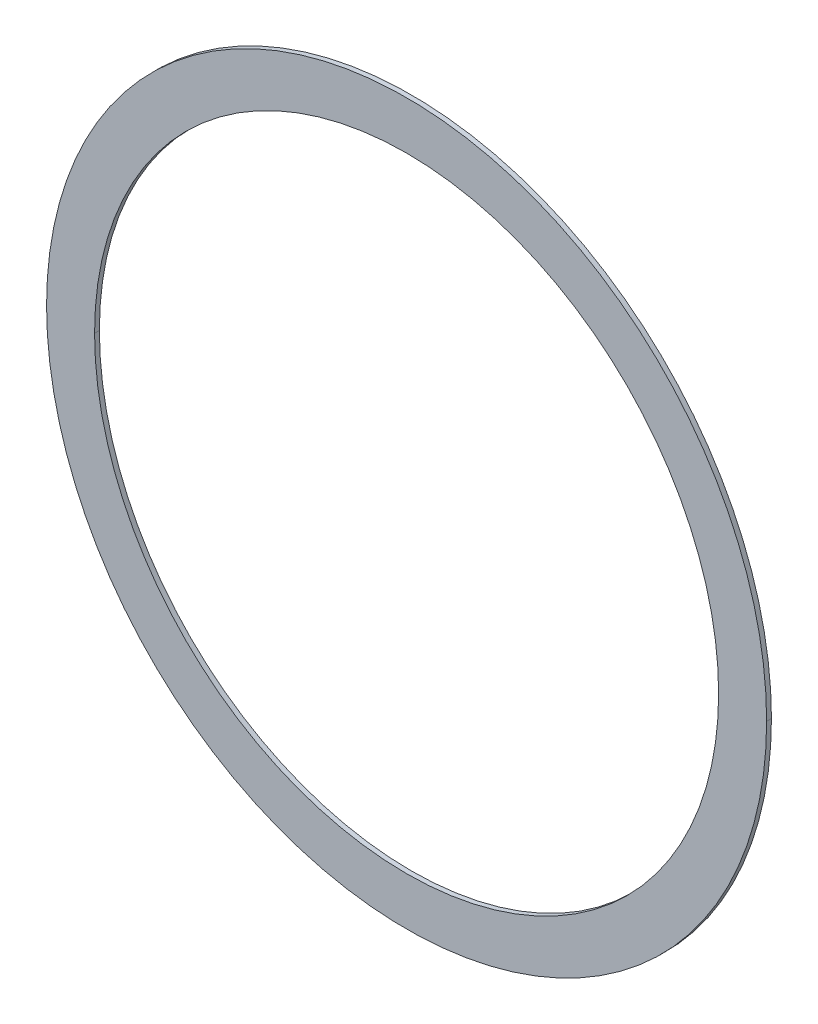
ISO-10303-21;
HEADER;
FILE_DESCRIPTION(('STEP AP214'),'2;1');
FILE_NAME('part.step','',(''),(''),'','','');
FILE_SCHEMA(('AUTOMOTIVE_DESIGN { 1 0 10303 214 1 1 1 1 }'));
ENDSEC;
DATA;
#1=APPLICATION_CONTEXT('core data for automotive mechanical design processes');
#2=APPLICATION_PROTOCOL_DEFINITION('international standard','automotive_design',2000,#1);
#3=PRODUCT_CONTEXT('',#1,'mechanical');
#4=PRODUCT('Part','Part','',(#3));
#5=PRODUCT_RELATED_PRODUCT_CATEGORY('part','',(#4));
#6=PRODUCT_DEFINITION_FORMATION('','',#4);
#7=PRODUCT_DEFINITION_CONTEXT('part definition',#1,'design');
#8=PRODUCT_DEFINITION('design','',#6,#7);
#9=PRODUCT_DEFINITION_SHAPE('','',#8);
#10=(LENGTH_UNIT() NAMED_UNIT(*) SI_UNIT(.MILLI.,.METRE.));
#11=(NAMED_UNIT(*) PLANE_ANGLE_UNIT() SI_UNIT($,.RADIAN.));
#12=(NAMED_UNIT(*) SI_UNIT($,.STERADIAN.) SOLID_ANGLE_UNIT());
#13=UNCERTAINTY_MEASURE_WITH_UNIT(LENGTH_MEASURE(1.E-05),#10,'distance_accuracy_value','');
#14=(GEOMETRIC_REPRESENTATION_CONTEXT(3) GLOBAL_UNCERTAINTY_ASSIGNED_CONTEXT((#13)) GLOBAL_UNIT_ASSIGNED_CONTEXT((#10,
#11,#12)) REPRESENTATION_CONTEXT('',''));
#15=CARTESIAN_POINT('',(0.,0.,0.));
#16=DIRECTION('',(0.,0.,1.));
#17=DIRECTION('',(1.,0.,0.));
#18=AXIS2_PLACEMENT_3D('',#15,#16,#17);
#19=CARTESIAN_POINT('',(0.,0.,-0.0015));
#20=DIRECTION('',(0.,0.,1.));
#21=DIRECTION('',(1.,0.,0.));
#22=AXIS2_PLACEMENT_3D('',#19,#20,#21);
#23=CYLINDRICAL_SURFACE('',#22,0.225);
#24=CARTESIAN_POINT('',(0.,0.,-0.0015));
#25=DIRECTION('',(0.,0.,1.));
#26=DIRECTION('',(1.,0.,0.));
#27=AXIS2_PLACEMENT_3D('',#24,#25,#26);
#28=CIRCLE('',#27,0.225);
#29=CARTESIAN_POINT('',(0.225,0.,-0.0015));
#30=VERTEX_POINT('',#29);
#31=CARTESIAN_POINT('',(-0.225,0.,-0.0015));
#32=VERTEX_POINT('',#31);
#33=EDGE_CURVE('E11',#30,#32,#28,.T.);
#34=ORIENTED_EDGE('',*,*,#33,.T.);
#35=DIRECTION('',(0.,0.,1.));
#36=VECTOR('',#35,1.);
#37=CARTESIAN_POINT('',(-0.225,0.,-0.0015));
#38=LINE('',#37,#36);
#39=CARTESIAN_POINT('',(-0.225,0.,0.0015));
#40=VERTEX_POINT('',#39);
#41=EDGE_CURVE('E24',#32,#40,#38,.T.);
#42=ORIENTED_EDGE('',*,*,#41,.T.);
#43=CARTESIAN_POINT('',(0.,0.,0.0015));
#44=DIRECTION('',(0.,0.,1.));
#45=DIRECTION('',(1.,0.,0.));
#46=AXIS2_PLACEMENT_3D('',#43,#44,#45);
#47=CIRCLE('',#46,0.225);
#48=CARTESIAN_POINT('',(0.225,0.,0.0015));
#49=VERTEX_POINT('',#48);
#50=EDGE_CURVE('E86',#49,#40,#47,.T.);
#51=ORIENTED_EDGE('',*,*,#50,.F.);
#52=DIRECTION('',(0.,0.,1.));
#53=VECTOR('',#52,1.);
#54=CARTESIAN_POINT('',(0.225,0.,-0.0015));
#55=LINE('',#54,#53);
#56=EDGE_CURVE('E83',#30,#49,#55,.T.);
#57=ORIENTED_EDGE('',*,*,#56,.F.);
#58=EDGE_LOOP('',(#34,#42,#51,#57));
#59=FACE_BOUND('',#58,.T.);
#60=ADVANCED_FACE('F17',(#59),#23,.T.);
#61=CARTESIAN_POINT('',(0.,0.,-0.0015));
#62=DIRECTION('',(0.,0.,1.));
#63=DIRECTION('',(1.,0.,0.));
#64=AXIS2_PLACEMENT_3D('',#61,#62,#63);
#65=CYLINDRICAL_SURFACE('',#64,0.195);
#66=CARTESIAN_POINT('',(0.,0.,-0.0015));
#67=DIRECTION('',(0.,0.,1.));
#68=DIRECTION('',(1.,0.,0.));
#69=AXIS2_PLACEMENT_3D('',#66,#67,#68);
#70=CIRCLE('',#69,0.195);
#71=CARTESIAN_POINT('',(-0.195,0.,-0.0015));
#72=VERTEX_POINT('',#71);
#73=CARTESIAN_POINT('',(0.195,0.,-0.0015));
#74=VERTEX_POINT('',#73);
#75=EDGE_CURVE('E81',#72,#74,#70,.T.);
#76=ORIENTED_EDGE('',*,*,#75,.F.);
#77=DIRECTION('',(0.,0.,1.));
#78=VECTOR('',#77,1.);
#79=CARTESIAN_POINT('',(-0.195,0.,-0.0015));
#80=LINE('',#79,#78);
#81=CARTESIAN_POINT('',(-0.195,0.,0.0015));
#82=VERTEX_POINT('',#81);
#83=EDGE_CURVE('E67',#72,#82,#80,.T.);
#84=ORIENTED_EDGE('',*,*,#83,.T.);
#85=CARTESIAN_POINT('',(0.,0.,0.0015));
#86=DIRECTION('',(0.,0.,1.));
#87=DIRECTION('',(1.,0.,0.));
#88=AXIS2_PLACEMENT_3D('',#85,#86,#87);
#89=CIRCLE('',#88,0.195);
#90=CARTESIAN_POINT('',(0.195,0.,0.0015));
#91=VERTEX_POINT('',#90);
#92=EDGE_CURVE('E63',#82,#91,#89,.T.);
#93=ORIENTED_EDGE('',*,*,#92,.T.);
#94=DIRECTION('',(0.,0.,1.));
#95=VECTOR('',#94,1.);
#96=CARTESIAN_POINT('',(0.195,0.,-0.0015));
#97=LINE('',#96,#95);
#98=EDGE_CURVE('E53',#74,#91,#97,.T.);
#99=ORIENTED_EDGE('',*,*,#98,.F.);
#100=EDGE_LOOP('',(#76,#84,#93,#99));
#101=FACE_BOUND('',#100,.T.);
#102=ADVANCED_FACE('F66',(#101),#65,.F.);
#103=CARTESIAN_POINT('',(0.,0.,-0.0015));
#104=DIRECTION('',(0.,0.,1.));
#105=DIRECTION('',(1.,0.,0.));
#106=AXIS2_PLACEMENT_3D('',#103,#104,#105);
#107=CYLINDRICAL_SURFACE('',#106,0.195);
#108=ORIENTED_EDGE('',*,*,#83,.F.);
#109=CARTESIAN_POINT('',(0.,0.,-0.0015));
#110=DIRECTION('',(0.,0.,1.));
#111=DIRECTION('',(1.,0.,0.));
#112=AXIS2_PLACEMENT_3D('',#109,#110,#111);
#113=CIRCLE('',#112,0.195);
#114=EDGE_CURVE('E59',#74,#72,#113,.T.);
#115=ORIENTED_EDGE('',*,*,#114,.F.);
#116=ORIENTED_EDGE('',*,*,#98,.T.);
#117=CARTESIAN_POINT('',(0.,0.,0.0015));
#118=DIRECTION('',(0.,0.,1.));
#119=DIRECTION('',(1.,0.,0.));
#120=AXIS2_PLACEMENT_3D('',#117,#118,#119);
#121=CIRCLE('',#120,0.195);
#122=EDGE_CURVE('E57',#91,#82,#121,.T.);
#123=ORIENTED_EDGE('',*,*,#122,.T.);
#124=EDGE_LOOP('',(#108,#115,#116,#123));
#125=FACE_BOUND('',#124,.T.);
#126=ADVANCED_FACE('F55',(#125),#107,.F.);
#127=CARTESIAN_POINT('',(0.,0.,-0.0015));
#128=DIRECTION('',(0.,0.,1.));
#129=DIRECTION('',(1.,0.,0.));
#130=AXIS2_PLACEMENT_3D('',#127,#128,#129);
#131=CYLINDRICAL_SURFACE('',#130,0.225);
#132=ORIENTED_EDGE('',*,*,#41,.F.);
#133=CARTESIAN_POINT('',(0.,0.,-0.0015));
#134=DIRECTION('',(0.,0.,1.));
#135=DIRECTION('',(1.,0.,0.));
#136=AXIS2_PLACEMENT_3D('',#133,#134,#135);
#137=CIRCLE('',#136,0.225);
#138=EDGE_CURVE('E72',#32,#30,#137,.T.);
#139=ORIENTED_EDGE('',*,*,#138,.T.);
#140=ORIENTED_EDGE('',*,*,#56,.T.);
#141=CARTESIAN_POINT('',(0.,0.,0.0015));
#142=DIRECTION('',(0.,0.,1.));
#143=DIRECTION('',(1.,0.,0.));
#144=AXIS2_PLACEMENT_3D('',#141,#142,#143);
#145=CIRCLE('',#144,0.225);
#146=EDGE_CURVE('E76',#40,#49,#145,.T.);
#147=ORIENTED_EDGE('',*,*,#146,.F.);
#148=EDGE_LOOP('',(#132,#139,#140,#147));
#149=FACE_BOUND('',#148,.T.);
#150=ADVANCED_FACE('F91',(#149),#131,.T.);
#151=CARTESIAN_POINT('',(0.,0.,-0.0015));
#152=DIRECTION('',(0.,0.,1.));
#153=DIRECTION('',(1.,0.,0.));
#154=AXIS2_PLACEMENT_3D('',#151,#152,#153);
#155=PLANE('',#154);
#156=ORIENTED_EDGE('',*,*,#114,.T.);
#157=ORIENTED_EDGE('',*,*,#75,.T.);
#158=EDGE_LOOP('',(#156,#157));
#159=FACE_BOUND('',#158,.T.);
#160=ORIENTED_EDGE('',*,*,#33,.F.);
#161=ORIENTED_EDGE('',*,*,#138,.F.);
#162=EDGE_LOOP('',(#160,#161));
#163=FACE_BOUND('',#162,.T.);
#164=ADVANCED_FACE('F92',(#159,#163),#155,.F.);
#165=CARTESIAN_POINT('',(0.,0.,0.0015));
#166=DIRECTION('',(0.,0.,1.));
#167=DIRECTION('',(1.,0.,0.));
#168=AXIS2_PLACEMENT_3D('',#165,#166,#167);
#169=PLANE('',#168);
#170=ORIENTED_EDGE('',*,*,#122,.F.);
#171=ORIENTED_EDGE('',*,*,#92,.F.);
#172=EDGE_LOOP('',(#170,#171));
#173=FACE_BOUND('',#172,.T.);
#174=ORIENTED_EDGE('',*,*,#50,.T.);
#175=ORIENTED_EDGE('',*,*,#146,.T.);
#176=EDGE_LOOP('',(#174,#175));
#177=FACE_BOUND('',#176,.T.);
#178=ADVANCED_FACE('F70',(#173,#177),#169,.T.);
#179=CLOSED_SHELL('',(#60,#102,#126,#150,#164,#178));
#180=MANIFOLD_SOLID_BREP('B1',#179);
#181=ADVANCED_BREP_SHAPE_REPRESENTATION('',(#18,#180),#14);
#182=SHAPE_DEFINITION_REPRESENTATION(#9,#181);
ENDSEC;
END-ISO-10303-21;
